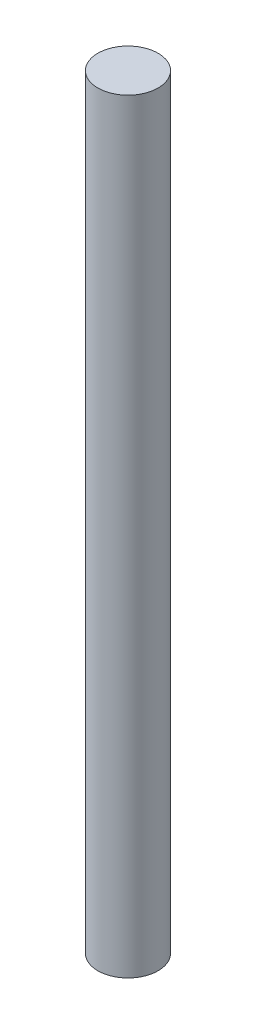
ISO-10303-21;
HEADER;
FILE_DESCRIPTION(('STEP AP214'),'2;1');
FILE_NAME('part.step','',(''),(''),'','','');
FILE_SCHEMA(('AUTOMOTIVE_DESIGN { 1 0 10303 214 1 1 1 1 }'));
ENDSEC;
DATA;
#1=APPLICATION_CONTEXT('core data for automotive mechanical design processes');
#2=APPLICATION_PROTOCOL_DEFINITION('international standard','automotive_design',2000,#1);
#3=PRODUCT_CONTEXT('',#1,'mechanical');
#4=PRODUCT('Part','Part','',(#3));
#5=PRODUCT_RELATED_PRODUCT_CATEGORY('part','',(#4));
#6=PRODUCT_DEFINITION_FORMATION('','',#4);
#7=PRODUCT_DEFINITION_CONTEXT('part definition',#1,'design');
#8=PRODUCT_DEFINITION('design','',#6,#7);
#9=PRODUCT_DEFINITION_SHAPE('','',#8);
#10=(LENGTH_UNIT() NAMED_UNIT(*) SI_UNIT(.MILLI.,.METRE.));
#11=(NAMED_UNIT(*) PLANE_ANGLE_UNIT() SI_UNIT($,.RADIAN.));
#12=(NAMED_UNIT(*) SI_UNIT($,.STERADIAN.) SOLID_ANGLE_UNIT());
#13=UNCERTAINTY_MEASURE_WITH_UNIT(LENGTH_MEASURE(1.E-05),#10,'distance_accuracy_value','');
#14=(GEOMETRIC_REPRESENTATION_CONTEXT(3) GLOBAL_UNCERTAINTY_ASSIGNED_CONTEXT((#13)) GLOBAL_UNIT_ASSIGNED_CONTEXT((#10,
#11,#12)) REPRESENTATION_CONTEXT('',''));
#15=CARTESIAN_POINT('',(0.,0.,0.));
#16=DIRECTION('',(0.,0.,1.));
#17=DIRECTION('',(1.,0.,0.));
#18=AXIS2_PLACEMENT_3D('',#15,#16,#17);
#19=CARTESIAN_POINT('',(0.,508.,0.));
#20=DIRECTION('',(0.,-1.,0.));
#21=DIRECTION('',(0.,0.,-1.));
#22=AXIS2_PLACEMENT_3D('',#19,#20,#21);
#23=CYLINDRICAL_SURFACE('',#22,20.0152);
#24=CARTESIAN_POINT('',(0.,508.,0.));
#25=DIRECTION('',(0.,1.,0.));
#26=DIRECTION('',(0.,0.,1.));
#27=AXIS2_PLACEMENT_3D('',#24,#25,#26);
#28=CIRCLE('',#27,20.0152);
#29=CARTESIAN_POINT('',(0.,508.,20.0152));
#30=VERTEX_POINT('',#29);
#31=EDGE_CURVE('E10',#30,#30,#28,.T.);
#32=ORIENTED_EDGE('',*,*,#31,.F.);
#33=EDGE_LOOP('',(#32));
#34=FACE_BOUND('',#33,.T.);
#35=CARTESIAN_POINT('',(0.,0.,0.));
#36=DIRECTION('',(0.,1.,0.));
#37=DIRECTION('',(0.,0.,1.));
#38=AXIS2_PLACEMENT_3D('',#35,#36,#37);
#39=CIRCLE('',#38,20.0152);
#40=CARTESIAN_POINT('',(0.,0.,20.0152));
#41=VERTEX_POINT('',#40);
#42=EDGE_CURVE('E40',#41,#41,#39,.T.);
#43=ORIENTED_EDGE('',*,*,#42,.T.);
#44=EDGE_LOOP('',(#43));
#45=FACE_BOUND('',#44,.T.);
#46=ADVANCED_FACE('F37',(#34,#45),#23,.T.);
#47=CARTESIAN_POINT('',(0.,508.,0.));
#48=DIRECTION('',(0.,1.,0.));
#49=DIRECTION('',(0.,0.,1.));
#50=AXIS2_PLACEMENT_3D('',#47,#48,#49);
#51=PLANE('',#50);
#52=ORIENTED_EDGE('',*,*,#31,.T.);
#53=EDGE_LOOP('',(#52));
#54=FACE_BOUND('',#53,.T.);
#55=ADVANCED_FACE('F70',(#54),#51,.T.);
#56=CARTESIAN_POINT('',(0.,0.,0.));
#57=DIRECTION('',(0.,1.,0.));
#58=DIRECTION('',(0.,0.,1.));
#59=AXIS2_PLACEMENT_3D('',#56,#57,#58);
#60=PLANE('',#59);
#61=CARTESIAN_POINT('',(0.,0.,0.));
#62=DIRECTION('',(0.,-1.,0.));
#63=DIRECTION('',(0.,0.,-1.));
#64=AXIS2_PLACEMENT_3D('',#61,#62,#63);
#65=CIRCLE('',#64,12.7);
#66=CARTESIAN_POINT('',(0.,0.,-12.7));
#67=VERTEX_POINT('',#66);
#68=EDGE_CURVE('E51',#67,#67,#65,.T.);
#69=ORIENTED_EDGE('',*,*,#68,.F.);
#70=EDGE_LOOP('',(#69));
#71=FACE_BOUND('',#70,.T.);
#72=ORIENTED_EDGE('',*,*,#42,.F.);
#73=EDGE_LOOP('',(#72));
#74=FACE_BOUND('',#73,.T.);
#75=ADVANCED_FACE('F64',(#71,#74),#60,.F.);
#76=CARTESIAN_POINT('',(0.,25.4,0.));
#77=DIRECTION('',(0.,-1.,0.));
#78=DIRECTION('',(0.,0.,-1.));
#79=AXIS2_PLACEMENT_3D('',#76,#77,#78);
#80=CYLINDRICAL_SURFACE('',#79,12.7);
#81=CARTESIAN_POINT('',(0.,25.4,0.));
#82=DIRECTION('',(0.,-1.,0.));
#83=DIRECTION('',(0.,0.,-1.));
#84=AXIS2_PLACEMENT_3D('',#81,#82,#83);
#85=CIRCLE('',#84,12.7);
#86=CARTESIAN_POINT('',(0.,25.4,-12.7));
#87=VERTEX_POINT('',#86);
#88=EDGE_CURVE('E49',#87,#87,#85,.T.);
#89=ORIENTED_EDGE('',*,*,#88,.F.);
#90=EDGE_LOOP('',(#89));
#91=FACE_BOUND('',#90,.T.);
#92=ORIENTED_EDGE('',*,*,#68,.T.);
#93=EDGE_LOOP('',(#92));
#94=FACE_BOUND('',#93,.T.);
#95=ADVANCED_FACE('F61',(#91,#94),#80,.F.);
#96=CARTESIAN_POINT('',(0.,25.4,0.));
#97=DIRECTION('',(0.,-1.,0.));
#98=DIRECTION('',(0.,0.,-1.));
#99=AXIS2_PLACEMENT_3D('',#96,#97,#98);
#100=PLANE('',#99);
#101=ORIENTED_EDGE('',*,*,#88,.T.);
#102=EDGE_LOOP('',(#101));
#103=FACE_BOUND('',#102,.T.);
#104=ADVANCED_FACE('F59',(#103),#100,.T.);
#105=CLOSED_SHELL('',(#46,#55,#75,#95,#104));
#106=MANIFOLD_SOLID_BREP('B2',#105);
#107=ADVANCED_BREP_SHAPE_REPRESENTATION('',(#18,#106),#14);
#108=SHAPE_DEFINITION_REPRESENTATION(#9,#107);
ENDSEC;
END-ISO-10303-21;
